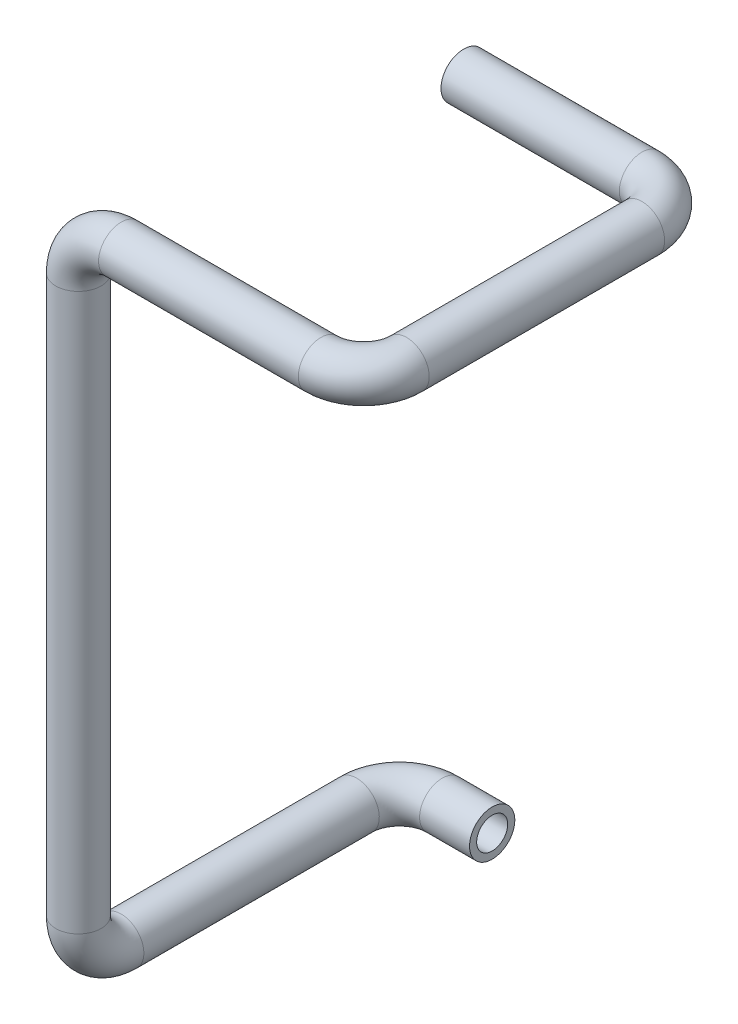
ISO-10303-21;
HEADER;
FILE_DESCRIPTION(('STEP AP214'),'2;1');
FILE_NAME('part.step','',(''),(''),'','','');
FILE_SCHEMA(('AUTOMOTIVE_DESIGN { 1 0 10303 214 1 1 1 1 }'));
ENDSEC;
DATA;
#1=APPLICATION_CONTEXT('core data for automotive mechanical design processes');
#2=APPLICATION_PROTOCOL_DEFINITION('international standard','automotive_design',2000,#1);
#3=PRODUCT_CONTEXT('',#1,'mechanical');
#4=PRODUCT('Part','Part','',(#3));
#5=PRODUCT_RELATED_PRODUCT_CATEGORY('part','',(#4));
#6=PRODUCT_DEFINITION_FORMATION('','',#4);
#7=PRODUCT_DEFINITION_CONTEXT('part definition',#1,'design');
#8=PRODUCT_DEFINITION('design','',#6,#7);
#9=PRODUCT_DEFINITION_SHAPE('','',#8);
#10=(LENGTH_UNIT() NAMED_UNIT(*) SI_UNIT(.MILLI.,.METRE.));
#11=(NAMED_UNIT(*) PLANE_ANGLE_UNIT() SI_UNIT($,.RADIAN.));
#12=(NAMED_UNIT(*) SI_UNIT($,.STERADIAN.) SOLID_ANGLE_UNIT());
#13=UNCERTAINTY_MEASURE_WITH_UNIT(LENGTH_MEASURE(1.E-05),#10,'distance_accuracy_value','');
#14=(GEOMETRIC_REPRESENTATION_CONTEXT(3) GLOBAL_UNCERTAINTY_ASSIGNED_CONTEXT((#13)) GLOBAL_UNIT_ASSIGNED_CONTEXT((#10,
#11,#12)) REPRESENTATION_CONTEXT('',''));
#15=CARTESIAN_POINT('',(0.,0.,0.));
#16=DIRECTION('',(0.,0.,1.));
#17=DIRECTION('',(1.,0.,0.));
#18=AXIS2_PLACEMENT_3D('',#15,#16,#17);
#19=CARTESIAN_POINT('',(163.,200.,50.));
#20=DIRECTION('',(1.,0.,0.));
#21=DIRECTION('',(0.,-1.,0.));
#22=AXIS2_PLACEMENT_3D('',#19,#20,#21);
#23=PLANE('',#22);
#24=CARTESIAN_POINT('',(163.,200.,50.));
#25=DIRECTION('',(1.,0.,0.));
#26=DIRECTION('',(0.,-1.,0.));
#27=AXIS2_PLACEMENT_3D('',#24,#25,#26);
#28=CIRCLE('',#27,2.175);
#29=CARTESIAN_POINT('',(163.,197.825,50.));
#30=VERTEX_POINT('',#29);
#31=EDGE_CURVE('E361',#30,#30,#28,.T.);
#32=ORIENTED_EDGE('',*,*,#31,.F.);
#33=EDGE_LOOP('',(#32));
#34=FACE_BOUND('',#33,.T.);
#35=CARTESIAN_POINT('',(163.,200.,50.));
#36=DIRECTION('',(1.,0.,0.));
#37=DIRECTION('',(0.,0.,-1.));
#38=AXIS2_PLACEMENT_3D('',#35,#36,#37);
#39=CIRCLE('',#38,3.175);
#40=CARTESIAN_POINT('',(163.,200.,46.825));
#41=VERTEX_POINT('',#40);
#42=EDGE_CURVE('E75',#41,#41,#39,.T.);
#43=ORIENTED_EDGE('',*,*,#42,.T.);
#44=EDGE_LOOP('',(#43));
#45=FACE_BOUND('',#44,.T.);
#46=ADVANCED_FACE('F52',(#34,#45),#23,.T.);
#47=CARTESIAN_POINT('',(159.,290.,50.));
#48=DIRECTION('',(1.,0.,0.));
#49=DIRECTION('',(0.,0.,-1.));
#50=AXIS2_PLACEMENT_3D('',#47,#48,#49);
#51=PLANE('',#50);
#52=CARTESIAN_POINT('',(159.,290.,50.));
#53=DIRECTION('',(1.,0.,0.));
#54=DIRECTION('',(0.,0.,-1.));
#55=AXIS2_PLACEMENT_3D('',#52,#53,#54);
#56=CIRCLE('',#55,2.175);
#57=CARTESIAN_POINT('',(159.,290.,47.825));
#58=VERTEX_POINT('',#57);
#59=EDGE_CURVE('E73',#58,#58,#56,.T.);
#60=ORIENTED_EDGE('',*,*,#59,.T.);
#61=EDGE_LOOP('',(#60));
#62=FACE_BOUND('',#61,.T.);
#63=CARTESIAN_POINT('',(159.,290.,50.));
#64=DIRECTION('',(1.,0.,0.));
#65=DIRECTION('',(0.,0.,-1.));
#66=AXIS2_PLACEMENT_3D('',#63,#64,#65);
#67=CIRCLE('',#66,3.175);
#68=CARTESIAN_POINT('',(159.,290.,46.825));
#69=VERTEX_POINT('',#68);
#70=EDGE_CURVE('E11',#69,#69,#67,.T.);
#71=ORIENTED_EDGE('',*,*,#70,.F.);
#72=EDGE_LOOP('',(#71));
#73=FACE_BOUND('',#72,.T.);
#74=ADVANCED_FACE('F180',(#62,#73),#51,.F.);
#75=CARTESIAN_POINT('',(163.,200.,50.));
#76=DIRECTION('',(-1.,0.,0.));
#77=DIRECTION('',(0.,0.,1.));
#78=AXIS2_PLACEMENT_3D('',#75,#76,#77);
#79=CYLINDRICAL_SURFACE('',#78,3.175);
#80=CARTESIAN_POINT('',(156.,200.,50.));
#81=DIRECTION('',(-1.,0.,0.));
#82=DIRECTION('',(0.,0.,1.));
#83=AXIS2_PLACEMENT_3D('',#80,#81,#82);
#84=CIRCLE('',#83,3.175);
#85=CARTESIAN_POINT('',(156.,200.,46.825));
#86=VERTEX_POINT('',#85);
#87=EDGE_CURVE('E74',#86,#86,#84,.F.);
#88=ORIENTED_EDGE('',*,*,#87,.T.);
#89=EDGE_LOOP('',(#88));
#90=FACE_BOUND('',#89,.T.);
#91=ORIENTED_EDGE('',*,*,#42,.F.);
#92=EDGE_LOOP('',(#91));
#93=FACE_BOUND('',#92,.T.);
#94=ADVANCED_FACE('F179',(#90,#93),#79,.T.);
#95=CARTESIAN_POINT('',(156.,200.,56.));
#96=DIRECTION('',(0.,1.,0.));
#97=DIRECTION('',(0.,0.,1.));
#98=AXIS2_PLACEMENT_3D('',#95,#96,#97);
#99=TOROIDAL_SURFACE('',#98,6.00000000000001,3.175);
#100=CARTESIAN_POINT('',(150.,200.,56.));
#101=DIRECTION('',(0.,0.,-1.));
#102=DIRECTION('',(-1.,0.,0.));
#103=AXIS2_PLACEMENT_3D('',#100,#101,#102);
#104=CIRCLE('',#103,3.175);
#105=CARTESIAN_POINT('',(146.825,200.,56.));
#106=VERTEX_POINT('',#105);
#107=EDGE_CURVE('E78',#106,#106,#104,.T.);
#108=CARTESIAN_POINT('',(156.,200.,56.));
#109=DIRECTION('',(0.,1.,0.));
#110=DIRECTION('',(0.,0.,1.));
#111=AXIS2_PLACEMENT_3D('',#108,#109,#110);
#112=CIRCLE('',#111,9.17500000000001);
#113=EDGE_CURVE('',#86,#106,#112,.T.);
#114=ORIENTED_EDGE('',*,*,#87,.F.);
#115=ORIENTED_EDGE('',*,*,#107,.T.);
#116=ORIENTED_EDGE('',*,*,#113,.T.);
#117=ORIENTED_EDGE('',*,*,#113,.F.);
#118=EDGE_LOOP('',(#114,#116,#115,#117));
#119=FACE_BOUND('',#118,.T.);
#120=ADVANCED_FACE('F189',(#119),#99,.T.);
#121=CARTESIAN_POINT('',(150.,200.,56.));
#122=DIRECTION('',(0.,0.,1.));
#123=DIRECTION('',(1.,0.,0.));
#124=AXIS2_PLACEMENT_3D('',#121,#122,#123);
#125=CYLINDRICAL_SURFACE('',#124,3.175);
#126=CARTESIAN_POINT('',(150.,200.,89.));
#127=DIRECTION('',(0.,0.,1.));
#128=DIRECTION('',(1.,0.,0.));
#129=AXIS2_PLACEMENT_3D('',#126,#127,#128);
#130=CIRCLE('',#129,3.175);
#131=CARTESIAN_POINT('',(150.,196.825,89.));
#132=VERTEX_POINT('',#131);
#133=EDGE_CURVE('E91',#132,#132,#130,.F.);
#134=ORIENTED_EDGE('',*,*,#133,.T.);
#135=EDGE_LOOP('',(#134));
#136=FACE_BOUND('',#135,.T.);
#137=ORIENTED_EDGE('',*,*,#107,.F.);
#138=EDGE_LOOP('',(#137));
#139=FACE_BOUND('',#138,.T.);
#140=ADVANCED_FACE('F187',(#136,#139),#125,.T.);
#141=CARTESIAN_POINT('',(150.,206.,89.));
#142=DIRECTION('',(-1.,0.,0.));
#143=DIRECTION('',(0.,0.,1.));
#144=AXIS2_PLACEMENT_3D('',#141,#142,#143);
#145=TOROIDAL_SURFACE('',#144,6.00000000000001,3.175);
#146=CARTESIAN_POINT('',(150.,206.,95.));
#147=DIRECTION('',(0.,-1.,0.));
#148=DIRECTION('',(0.,0.,-1.));
#149=AXIS2_PLACEMENT_3D('',#146,#147,#148);
#150=CIRCLE('',#149,3.175);
#151=CARTESIAN_POINT('',(150.,206.,98.175));
#152=VERTEX_POINT('',#151);
#153=EDGE_CURVE('E96',#152,#152,#150,.T.);
#154=CARTESIAN_POINT('',(150.,206.,89.));
#155=DIRECTION('',(-1.,0.,0.));
#156=DIRECTION('',(0.,0.,1.));
#157=AXIS2_PLACEMENT_3D('',#154,#155,#156);
#158=CIRCLE('',#157,9.175);
#159=EDGE_CURVE('',#132,#152,#158,.T.);
#160=ORIENTED_EDGE('',*,*,#133,.F.);
#161=ORIENTED_EDGE('',*,*,#153,.T.);
#162=ORIENTED_EDGE('',*,*,#159,.T.);
#163=ORIENTED_EDGE('',*,*,#159,.F.);
#164=EDGE_LOOP('',(#160,#162,#161,#163));
#165=FACE_BOUND('',#164,.T.);
#166=ADVANCED_FACE('F193',(#165),#145,.T.);
#167=CARTESIAN_POINT('',(150.,206.,95.));
#168=DIRECTION('',(0.,1.,0.));
#169=DIRECTION('',(0.,0.,1.));
#170=AXIS2_PLACEMENT_3D('',#167,#168,#169);
#171=CYLINDRICAL_SURFACE('',#170,3.175);
#172=CARTESIAN_POINT('',(150.,284.,95.));
#173=DIRECTION('',(0.,1.,0.));
#174=DIRECTION('',(0.,0.,1.));
#175=AXIS2_PLACEMENT_3D('',#172,#173,#174);
#176=CIRCLE('',#175,3.175);
#177=CARTESIAN_POINT('',(146.825,284.,95.));
#178=VERTEX_POINT('',#177);
#179=EDGE_CURVE('E97',#178,#178,#176,.F.);
#180=ORIENTED_EDGE('',*,*,#179,.T.);
#181=EDGE_LOOP('',(#180));
#182=FACE_BOUND('',#181,.T.);
#183=ORIENTED_EDGE('',*,*,#153,.F.);
#184=EDGE_LOOP('',(#183));
#185=FACE_BOUND('',#184,.T.);
#186=ADVANCED_FACE('F196',(#182,#185),#171,.T.);
#187=CARTESIAN_POINT('',(156.,284.,95.));
#188=DIRECTION('',(0.,0.,-1.));
#189=DIRECTION('',(-1.,0.,0.));
#190=AXIS2_PLACEMENT_3D('',#187,#188,#189);
#191=TOROIDAL_SURFACE('',#190,6.00000000000003,3.175);
#192=CARTESIAN_POINT('',(156.,290.,95.));
#193=DIRECTION('',(-1.,0.,0.));
#194=DIRECTION('',(0.,-1.,0.));
#195=AXIS2_PLACEMENT_3D('',#192,#193,#194);
#196=CIRCLE('',#195,3.175);
#197=CARTESIAN_POINT('',(156.,293.175,95.));
#198=VERTEX_POINT('',#197);
#199=EDGE_CURVE('E105',#198,#198,#196,.T.);
#200=CARTESIAN_POINT('',(156.,284.,95.));
#201=DIRECTION('',(0.,0.,-1.));
#202=DIRECTION('',(-1.,0.,0.));
#203=AXIS2_PLACEMENT_3D('',#200,#201,#202);
#204=CIRCLE('',#203,9.17500000000003);
#205=EDGE_CURVE('',#178,#198,#204,.T.);
#206=ORIENTED_EDGE('',*,*,#179,.F.);
#207=ORIENTED_EDGE('',*,*,#199,.T.);
#208=ORIENTED_EDGE('',*,*,#205,.T.);
#209=ORIENTED_EDGE('',*,*,#205,.F.);
#210=EDGE_LOOP('',(#206,#208,#207,#209));
#211=FACE_BOUND('',#210,.T.);
#212=ADVANCED_FACE('F205',(#211),#191,.T.);
#213=CARTESIAN_POINT('',(156.,290.,95.));
#214=DIRECTION('',(1.,0.,0.));
#215=DIRECTION('',(0.,0.,-1.));
#216=AXIS2_PLACEMENT_3D('',#213,#214,#215);
#217=CYLINDRICAL_SURFACE('',#216,3.175);
#218=CARTESIAN_POINT('',(184.,290.,95.));
#219=DIRECTION('',(1.,0.,0.));
#220=DIRECTION('',(0.,0.,-1.));
#221=AXIS2_PLACEMENT_3D('',#218,#219,#220);
#222=CIRCLE('',#221,3.175);
#223=CARTESIAN_POINT('',(184.,290.,98.175));
#224=VERTEX_POINT('',#223);
#225=EDGE_CURVE('E104',#224,#224,#222,.F.);
#226=ORIENTED_EDGE('',*,*,#225,.T.);
#227=EDGE_LOOP('',(#226));
#228=FACE_BOUND('',#227,.T.);
#229=ORIENTED_EDGE('',*,*,#199,.F.);
#230=EDGE_LOOP('',(#229));
#231=FACE_BOUND('',#230,.T.);
#232=ADVANCED_FACE('F125',(#228,#231),#217,.T.);
#233=CARTESIAN_POINT('',(184.,290.,89.));
#234=DIRECTION('',(0.,1.,0.));
#235=DIRECTION('',(0.,0.,1.));
#236=AXIS2_PLACEMENT_3D('',#233,#234,#235);
#237=TOROIDAL_SURFACE('',#236,6.00000000000001,3.175);
#238=CARTESIAN_POINT('',(190.,290.,89.));
#239=DIRECTION('',(0.,0.,1.));
#240=DIRECTION('',(1.,0.,0.));
#241=AXIS2_PLACEMENT_3D('',#238,#239,#240);
#242=CIRCLE('',#241,3.175);
#243=CARTESIAN_POINT('',(193.175,290.,89.));
#244=VERTEX_POINT('',#243);
#245=EDGE_CURVE('E68',#244,#244,#242,.T.);
#246=CARTESIAN_POINT('',(184.,290.,89.));
#247=DIRECTION('',(0.,1.,0.));
#248=DIRECTION('',(0.,0.,1.));
#249=AXIS2_PLACEMENT_3D('',#246,#247,#248);
#250=CIRCLE('',#249,9.175);
#251=EDGE_CURVE('',#224,#244,#250,.T.);
#252=ORIENTED_EDGE('',*,*,#225,.F.);
#253=ORIENTED_EDGE('',*,*,#245,.T.);
#254=ORIENTED_EDGE('',*,*,#251,.T.);
#255=ORIENTED_EDGE('',*,*,#251,.F.);
#256=EDGE_LOOP('',(#252,#254,#253,#255));
#257=FACE_BOUND('',#256,.T.);
#258=ADVANCED_FACE('F109',(#257),#237,.T.);
#259=CARTESIAN_POINT('',(190.,290.,89.));
#260=DIRECTION('',(0.,0.,-1.));
#261=DIRECTION('',(-1.,0.,0.));
#262=AXIS2_PLACEMENT_3D('',#259,#260,#261);
#263=CYLINDRICAL_SURFACE('',#262,3.175);
#264=CARTESIAN_POINT('',(190.,290.,56.));
#265=DIRECTION('',(0.,0.,-1.));
#266=DIRECTION('',(-1.,0.,0.));
#267=AXIS2_PLACEMENT_3D('',#264,#265,#266);
#268=CIRCLE('',#267,3.175);
#269=CARTESIAN_POINT('',(193.175,290.,56.));
#270=VERTEX_POINT('',#269);
#271=EDGE_CURVE('E63',#270,#270,#268,.F.);
#272=ORIENTED_EDGE('',*,*,#271,.T.);
#273=EDGE_LOOP('',(#272));
#274=FACE_BOUND('',#273,.T.);
#275=ORIENTED_EDGE('',*,*,#245,.F.);
#276=EDGE_LOOP('',(#275));
#277=FACE_BOUND('',#276,.T.);
#278=ADVANCED_FACE('F114',(#274,#277),#263,.T.);
#279=CARTESIAN_POINT('',(184.,290.,56.));
#280=DIRECTION('',(0.,1.,0.));
#281=DIRECTION('',(0.,0.,1.));
#282=AXIS2_PLACEMENT_3D('',#279,#280,#281);
#283=TOROIDAL_SURFACE('',#282,6.00000000000001,3.175);
#284=CARTESIAN_POINT('',(184.,290.,50.));
#285=DIRECTION('',(1.,0.,0.));
#286=DIRECTION('',(0.,0.,-1.));
#287=AXIS2_PLACEMENT_3D('',#284,#285,#286);
#288=CIRCLE('',#287,3.175);
#289=CARTESIAN_POINT('',(184.,290.,46.825));
#290=VERTEX_POINT('',#289);
#291=EDGE_CURVE('E58',#290,#290,#288,.T.);
#292=CARTESIAN_POINT('',(184.,290.,56.));
#293=DIRECTION('',(0.,1.,0.));
#294=DIRECTION('',(0.,0.,1.));
#295=AXIS2_PLACEMENT_3D('',#292,#293,#294);
#296=CIRCLE('',#295,9.175);
#297=EDGE_CURVE('',#270,#290,#296,.T.);
#298=ORIENTED_EDGE('',*,*,#271,.F.);
#299=ORIENTED_EDGE('',*,*,#291,.T.);
#300=ORIENTED_EDGE('',*,*,#297,.T.);
#301=ORIENTED_EDGE('',*,*,#297,.F.);
#302=EDGE_LOOP('',(#298,#300,#299,#301));
#303=FACE_BOUND('',#302,.T.);
#304=ADVANCED_FACE('F113',(#303),#283,.T.);
#305=CARTESIAN_POINT('',(184.,290.,50.));
#306=DIRECTION('',(-1.,0.,0.));
#307=DIRECTION('',(0.,0.,1.));
#308=AXIS2_PLACEMENT_3D('',#305,#306,#307);
#309=CYLINDRICAL_SURFACE('',#308,3.175);
#310=ORIENTED_EDGE('',*,*,#70,.T.);
#311=EDGE_LOOP('',(#310));
#312=FACE_BOUND('',#311,.T.);
#313=ORIENTED_EDGE('',*,*,#291,.F.);
#314=EDGE_LOOP('',(#313));
#315=FACE_BOUND('',#314,.T.);
#316=ADVANCED_FACE('F54',(#312,#315),#309,.T.);
#317=CARTESIAN_POINT('',(163.,200.,50.));
#318=DIRECTION('',(-1.,0.,0.));
#319=DIRECTION('',(0.,0.,1.));
#320=AXIS2_PLACEMENT_3D('',#317,#318,#319);
#321=CYLINDRICAL_SURFACE('',#320,2.175);
#322=CARTESIAN_POINT('',(156.,200.,50.));
#323=DIRECTION('',(1.,0.,0.));
#324=DIRECTION('',(0.,-1.,0.));
#325=AXIS2_PLACEMENT_3D('',#322,#323,#324);
#326=CIRCLE('',#325,2.175);
#327=CARTESIAN_POINT('',(156.,200.,47.825));
#328=VERTEX_POINT('',#327);
#329=EDGE_CURVE('E365',#328,#328,#326,.T.);
#330=ORIENTED_EDGE('',*,*,#329,.F.);
#331=EDGE_LOOP('',(#330));
#332=FACE_BOUND('',#331,.T.);
#333=ORIENTED_EDGE('',*,*,#31,.T.);
#334=EDGE_LOOP('',(#333));
#335=FACE_BOUND('',#334,.T.);
#336=ADVANCED_FACE('F124',(#332,#335),#321,.F.);
#337=CARTESIAN_POINT('',(156.,200.,56.));
#338=DIRECTION('',(0.,1.,0.));
#339=DIRECTION('',(0.,0.,1.));
#340=AXIS2_PLACEMENT_3D('',#337,#338,#339);
#341=TOROIDAL_SURFACE('',#340,6.00000000000001,2.175);
#342=CARTESIAN_POINT('',(150.,200.,56.));
#343=DIRECTION('',(0.,0.,-1.));
#344=DIRECTION('',(0.,-1.,0.));
#345=AXIS2_PLACEMENT_3D('',#342,#343,#344);
#346=CIRCLE('',#345,2.175);
#347=CARTESIAN_POINT('',(147.825,200.,56.));
#348=VERTEX_POINT('',#347);
#349=EDGE_CURVE('E370',#348,#348,#346,.T.);
#350=CARTESIAN_POINT('',(156.,200.,56.));
#351=DIRECTION('',(0.,1.,0.));
#352=DIRECTION('',(0.,0.,1.));
#353=AXIS2_PLACEMENT_3D('',#350,#351,#352);
#354=CIRCLE('',#353,8.17500000000001);
#355=EDGE_CURVE('',#328,#348,#354,.T.);
#356=ORIENTED_EDGE('',*,*,#329,.T.);
#357=ORIENTED_EDGE('',*,*,#349,.F.);
#358=ORIENTED_EDGE('',*,*,#355,.T.);
#359=ORIENTED_EDGE('',*,*,#355,.F.);
#360=EDGE_LOOP('',(#356,#358,#357,#359));
#361=FACE_BOUND('',#360,.T.);
#362=ADVANCED_FACE('F129',(#361),#341,.F.);
#363=CARTESIAN_POINT('',(150.,200.,56.));
#364=DIRECTION('',(0.,0.,1.));
#365=DIRECTION('',(1.,0.,0.));
#366=AXIS2_PLACEMENT_3D('',#363,#364,#365);
#367=CYLINDRICAL_SURFACE('',#366,2.175);
#368=CARTESIAN_POINT('',(150.,200.,89.));
#369=DIRECTION('',(0.,0.,-1.));
#370=DIRECTION('',(0.,-1.,0.));
#371=AXIS2_PLACEMENT_3D('',#368,#369,#370);
#372=CIRCLE('',#371,2.175);
#373=CARTESIAN_POINT('',(150.,197.825,89.));
#374=VERTEX_POINT('',#373);
#375=EDGE_CURVE('E375',#374,#374,#372,.T.);
#376=ORIENTED_EDGE('',*,*,#375,.F.);
#377=EDGE_LOOP('',(#376));
#378=FACE_BOUND('',#377,.T.);
#379=ORIENTED_EDGE('',*,*,#349,.T.);
#380=EDGE_LOOP('',(#379));
#381=FACE_BOUND('',#380,.T.);
#382=ADVANCED_FACE('F136',(#378,#381),#367,.F.);
#383=CARTESIAN_POINT('',(150.,206.,89.));
#384=DIRECTION('',(-1.,0.,0.));
#385=DIRECTION('',(0.,0.,1.));
#386=AXIS2_PLACEMENT_3D('',#383,#384,#385);
#387=TOROIDAL_SURFACE('',#386,6.00000000000001,2.175);
#388=CARTESIAN_POINT('',(150.,206.,95.));
#389=DIRECTION('',(0.,-1.,0.));
#390=DIRECTION('',(0.,0.,1.));
#391=AXIS2_PLACEMENT_3D('',#388,#389,#390);
#392=CIRCLE('',#391,2.175);
#393=CARTESIAN_POINT('',(150.,206.,97.175));
#394=VERTEX_POINT('',#393);
#395=EDGE_CURVE('E374',#394,#394,#392,.T.);
#396=CARTESIAN_POINT('',(150.,206.,89.));
#397=DIRECTION('',(-1.,0.,0.));
#398=DIRECTION('',(0.,0.,1.));
#399=AXIS2_PLACEMENT_3D('',#396,#397,#398);
#400=CIRCLE('',#399,8.175);
#401=EDGE_CURVE('',#374,#394,#400,.T.);
#402=ORIENTED_EDGE('',*,*,#375,.T.);
#403=ORIENTED_EDGE('',*,*,#395,.F.);
#404=ORIENTED_EDGE('',*,*,#401,.T.);
#405=ORIENTED_EDGE('',*,*,#401,.F.);
#406=EDGE_LOOP('',(#402,#404,#403,#405));
#407=FACE_BOUND('',#406,.T.);
#408=ADVANCED_FACE('F145',(#407),#387,.F.);
#409=CARTESIAN_POINT('',(150.,206.,95.));
#410=DIRECTION('',(0.,1.,0.));
#411=DIRECTION('',(0.,0.,1.));
#412=AXIS2_PLACEMENT_3D('',#409,#410,#411);
#413=CYLINDRICAL_SURFACE('',#412,2.175);
#414=CARTESIAN_POINT('',(150.,284.,95.));
#415=DIRECTION('',(0.,-1.,0.));
#416=DIRECTION('',(0.,0.,1.));
#417=AXIS2_PLACEMENT_3D('',#414,#415,#416);
#418=CIRCLE('',#417,2.175);
#419=CARTESIAN_POINT('',(147.825,284.,95.));
#420=VERTEX_POINT('',#419);
#421=EDGE_CURVE('E378',#420,#420,#418,.T.);
#422=ORIENTED_EDGE('',*,*,#421,.F.);
#423=EDGE_LOOP('',(#422));
#424=FACE_BOUND('',#423,.T.);
#425=ORIENTED_EDGE('',*,*,#395,.T.);
#426=EDGE_LOOP('',(#425));
#427=FACE_BOUND('',#426,.T.);
#428=ADVANCED_FACE('F146',(#424,#427),#413,.F.);
#429=CARTESIAN_POINT('',(156.,284.,95.));
#430=DIRECTION('',(0.,0.,-1.));
#431=DIRECTION('',(-1.,0.,0.));
#432=AXIS2_PLACEMENT_3D('',#429,#430,#431);
#433=TOROIDAL_SURFACE('',#432,6.00000000000003,2.175);
#434=CARTESIAN_POINT('',(156.,290.,95.));
#435=DIRECTION('',(-1.,0.,0.));
#436=DIRECTION('',(0.,0.,1.));
#437=AXIS2_PLACEMENT_3D('',#434,#435,#436);
#438=CIRCLE('',#437,2.175);
#439=CARTESIAN_POINT('',(156.,292.175,95.));
#440=VERTEX_POINT('',#439);
#441=EDGE_CURVE('E381',#440,#440,#438,.T.);
#442=CARTESIAN_POINT('',(156.,284.,95.));
#443=DIRECTION('',(0.,0.,-1.));
#444=DIRECTION('',(-1.,0.,0.));
#445=AXIS2_PLACEMENT_3D('',#442,#443,#444);
#446=CIRCLE('',#445,8.17500000000003);
#447=EDGE_CURVE('',#420,#440,#446,.T.);
#448=ORIENTED_EDGE('',*,*,#421,.T.);
#449=ORIENTED_EDGE('',*,*,#441,.F.);
#450=ORIENTED_EDGE('',*,*,#447,.T.);
#451=ORIENTED_EDGE('',*,*,#447,.F.);
#452=EDGE_LOOP('',(#448,#450,#449,#451));
#453=FACE_BOUND('',#452,.T.);
#454=ADVANCED_FACE('F155',(#453),#433,.F.);
#455=CARTESIAN_POINT('',(156.,290.,95.));
#456=DIRECTION('',(1.,0.,0.));
#457=DIRECTION('',(0.,0.,-1.));
#458=AXIS2_PLACEMENT_3D('',#455,#456,#457);
#459=CYLINDRICAL_SURFACE('',#458,2.175);
#460=CARTESIAN_POINT('',(184.,290.,95.));
#461=DIRECTION('',(-1.,0.,0.));
#462=DIRECTION('',(0.,0.,1.));
#463=AXIS2_PLACEMENT_3D('',#460,#461,#462);
#464=CIRCLE('',#463,2.175);
#465=CARTESIAN_POINT('',(184.,290.,97.175));
#466=VERTEX_POINT('',#465);
#467=EDGE_CURVE('E383',#466,#466,#464,.T.);
#468=ORIENTED_EDGE('',*,*,#467,.F.);
#469=EDGE_LOOP('',(#468));
#470=FACE_BOUND('',#469,.T.);
#471=ORIENTED_EDGE('',*,*,#441,.T.);
#472=EDGE_LOOP('',(#471));
#473=FACE_BOUND('',#472,.T.);
#474=ADVANCED_FACE('F156',(#470,#473),#459,.F.);
#475=CARTESIAN_POINT('',(184.,290.,89.));
#476=DIRECTION('',(0.,1.,0.));
#477=DIRECTION('',(0.,0.,1.));
#478=AXIS2_PLACEMENT_3D('',#475,#476,#477);
#479=TOROIDAL_SURFACE('',#478,6.00000000000001,2.175);
#480=CARTESIAN_POINT('',(190.,290.,89.));
#481=DIRECTION('',(0.,0.,1.));
#482=DIRECTION('',(1.,0.,0.));
#483=AXIS2_PLACEMENT_3D('',#480,#481,#482);
#484=CIRCLE('',#483,2.175);
#485=CARTESIAN_POINT('',(192.175,290.,89.));
#486=VERTEX_POINT('',#485);
#487=EDGE_CURVE('E390',#486,#486,#484,.T.);
#488=CARTESIAN_POINT('',(184.,290.,89.));
#489=DIRECTION('',(0.,1.,0.));
#490=DIRECTION('',(0.,0.,1.));
#491=AXIS2_PLACEMENT_3D('',#488,#489,#490);
#492=CIRCLE('',#491,8.175);
#493=EDGE_CURVE('',#466,#486,#492,.T.);
#494=ORIENTED_EDGE('',*,*,#467,.T.);
#495=ORIENTED_EDGE('',*,*,#487,.F.);
#496=ORIENTED_EDGE('',*,*,#493,.T.);
#497=ORIENTED_EDGE('',*,*,#493,.F.);
#498=EDGE_LOOP('',(#494,#496,#495,#497));
#499=FACE_BOUND('',#498,.T.);
#500=ADVANCED_FACE('F159',(#499),#479,.F.);
#501=CARTESIAN_POINT('',(190.,290.,89.));
#502=DIRECTION('',(0.,0.,-1.));
#503=DIRECTION('',(-1.,0.,0.));
#504=AXIS2_PLACEMENT_3D('',#501,#502,#503);
#505=CYLINDRICAL_SURFACE('',#504,2.175);
#506=CARTESIAN_POINT('',(190.,290.,56.));
#507=DIRECTION('',(0.,0.,1.));
#508=DIRECTION('',(1.,0.,0.));
#509=AXIS2_PLACEMENT_3D('',#506,#507,#508);
#510=CIRCLE('',#509,2.175);
#511=CARTESIAN_POINT('',(192.175,290.,56.));
#512=VERTEX_POINT('',#511);
#513=EDGE_CURVE('E87',#512,#512,#510,.T.);
#514=ORIENTED_EDGE('',*,*,#513,.F.);
#515=EDGE_LOOP('',(#514));
#516=FACE_BOUND('',#515,.T.);
#517=ORIENTED_EDGE('',*,*,#487,.T.);
#518=EDGE_LOOP('',(#517));
#519=FACE_BOUND('',#518,.T.);
#520=ADVANCED_FACE('F163',(#516,#519),#505,.F.);
#521=CARTESIAN_POINT('',(184.,290.,56.));
#522=DIRECTION('',(0.,1.,0.));
#523=DIRECTION('',(0.,0.,1.));
#524=AXIS2_PLACEMENT_3D('',#521,#522,#523);
#525=TOROIDAL_SURFACE('',#524,6.00000000000001,2.175);
#526=CARTESIAN_POINT('',(184.,290.,50.));
#527=DIRECTION('',(1.,0.,0.));
#528=DIRECTION('',(0.,0.,-1.));
#529=AXIS2_PLACEMENT_3D('',#526,#527,#528);
#530=CIRCLE('',#529,2.175);
#531=CARTESIAN_POINT('',(184.,290.,47.825));
#532=VERTEX_POINT('',#531);
#533=EDGE_CURVE('E85',#532,#532,#530,.T.);
#534=CARTESIAN_POINT('',(184.,290.,56.));
#535=DIRECTION('',(0.,1.,0.));
#536=DIRECTION('',(0.,0.,1.));
#537=AXIS2_PLACEMENT_3D('',#534,#535,#536);
#538=CIRCLE('',#537,8.175);
#539=EDGE_CURVE('',#512,#532,#538,.T.);
#540=ORIENTED_EDGE('',*,*,#513,.T.);
#541=ORIENTED_EDGE('',*,*,#533,.F.);
#542=ORIENTED_EDGE('',*,*,#539,.T.);
#543=ORIENTED_EDGE('',*,*,#539,.F.);
#544=EDGE_LOOP('',(#540,#542,#541,#543));
#545=FACE_BOUND('',#544,.T.);
#546=ADVANCED_FACE('F169',(#545),#525,.F.);
#547=CARTESIAN_POINT('',(184.,290.,50.));
#548=DIRECTION('',(-1.,0.,0.));
#549=DIRECTION('',(0.,0.,1.));
#550=AXIS2_PLACEMENT_3D('',#547,#548,#549);
#551=CYLINDRICAL_SURFACE('',#550,2.175);
#552=ORIENTED_EDGE('',*,*,#59,.F.);
#553=EDGE_LOOP('',(#552));
#554=FACE_BOUND('',#553,.T.);
#555=ORIENTED_EDGE('',*,*,#533,.T.);
#556=EDGE_LOOP('',(#555));
#557=FACE_BOUND('',#556,.T.);
#558=ADVANCED_FACE('F171',(#554,#557),#551,.F.);
#559=CLOSED_SHELL('',(#46,#74,#94,#120,#140,#166,#186,#212,#232,#258,#278,#304,#316,#336,#362,
#382,#408,#428,#454,#474,#500,#520,#546,#558));
#560=MANIFOLD_SOLID_BREP('B2',#559);
#561=ADVANCED_BREP_SHAPE_REPRESENTATION('',(#18,#560),#14);
#562=SHAPE_DEFINITION_REPRESENTATION(#9,#561);
ENDSEC;
END-ISO-10303-21;
